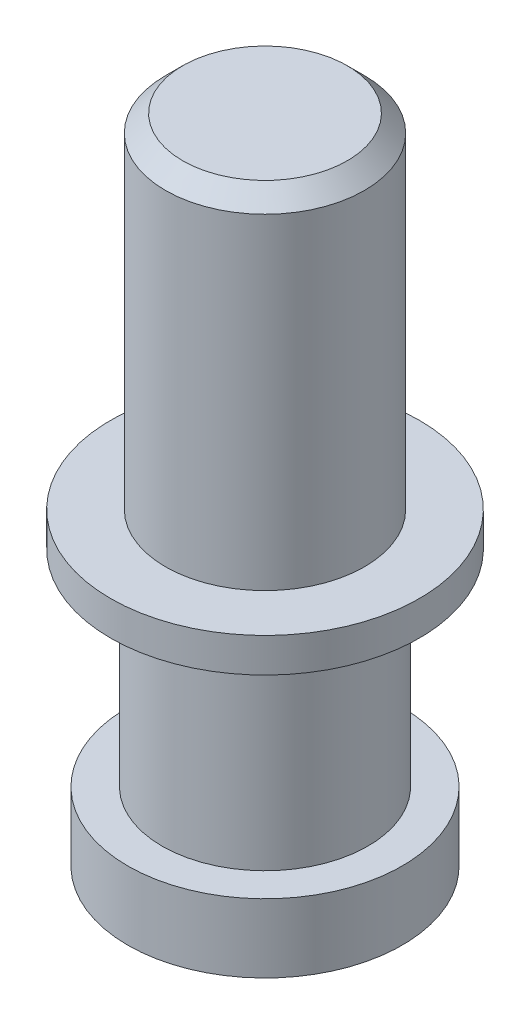
ISO-10303-21;
HEADER;
FILE_DESCRIPTION(('STEP AP214'),'2;1');
FILE_NAME('part.step','',(''),(''),'','','');
FILE_SCHEMA(('AUTOMOTIVE_DESIGN { 1 0 10303 214 1 1 1 1 }'));
ENDSEC;
DATA;
#1=APPLICATION_CONTEXT('core data for automotive mechanical design processes');
#2=APPLICATION_PROTOCOL_DEFINITION('international standard','automotive_design',2000,#1);
#3=PRODUCT_CONTEXT('',#1,'mechanical');
#4=PRODUCT('Part','Part','',(#3));
#5=PRODUCT_RELATED_PRODUCT_CATEGORY('part','',(#4));
#6=PRODUCT_DEFINITION_FORMATION('','',#4);
#7=PRODUCT_DEFINITION_CONTEXT('part definition',#1,'design');
#8=PRODUCT_DEFINITION('design','',#6,#7);
#9=PRODUCT_DEFINITION_SHAPE('','',#8);
#10=(LENGTH_UNIT() NAMED_UNIT(*) SI_UNIT(.MILLI.,.METRE.));
#11=(NAMED_UNIT(*) PLANE_ANGLE_UNIT() SI_UNIT($,.RADIAN.));
#12=(NAMED_UNIT(*) SI_UNIT($,.STERADIAN.) SOLID_ANGLE_UNIT());
#13=UNCERTAINTY_MEASURE_WITH_UNIT(LENGTH_MEASURE(1.E-05),#10,'distance_accuracy_value','');
#14=(GEOMETRIC_REPRESENTATION_CONTEXT(3) GLOBAL_UNCERTAINTY_ASSIGNED_CONTEXT((#13)) GLOBAL_UNIT_ASSIGNED_CONTEXT((#10,
#11,#12)) REPRESENTATION_CONTEXT('',''));
#15=CARTESIAN_POINT('',(0.,0.,0.));
#16=DIRECTION('',(0.,0.,1.));
#17=DIRECTION('',(1.,0.,0.));
#18=AXIS2_PLACEMENT_3D('',#15,#16,#17);
#19=CARTESIAN_POINT('',(0.,1.,0.));
#20=DIRECTION('',(0.,-1.,0.));
#21=DIRECTION('',(0.,0.,-1.));
#22=AXIS2_PLACEMENT_3D('',#19,#20,#21);
#23=CYLINDRICAL_SURFACE('',#22,2.);
#24=CARTESIAN_POINT('',(0.,1.,0.));
#25=DIRECTION('',(0.,1.,0.));
#26=DIRECTION('',(0.,0.,1.));
#27=AXIS2_PLACEMENT_3D('',#24,#25,#26);
#28=CIRCLE('',#27,2.);
#29=CARTESIAN_POINT('',(0.,1.,2.));
#30=VERTEX_POINT('',#29);
#31=EDGE_CURVE('E59',#30,#30,#28,.T.);
#32=ORIENTED_EDGE('',*,*,#31,.F.);
#33=EDGE_LOOP('',(#32));
#34=FACE_BOUND('',#33,.T.);
#35=CARTESIAN_POINT('',(0.,0.,0.));
#36=DIRECTION('',(0.,1.,0.));
#37=DIRECTION('',(0.,0.,1.));
#38=AXIS2_PLACEMENT_3D('',#35,#36,#37);
#39=CIRCLE('',#38,2.);
#40=CARTESIAN_POINT('',(0.,0.,2.));
#41=VERTEX_POINT('',#40);
#42=EDGE_CURVE('E56',#41,#41,#39,.T.);
#43=ORIENTED_EDGE('',*,*,#42,.T.);
#44=EDGE_LOOP('',(#43));
#45=FACE_BOUND('',#44,.T.);
#46=ADVANCED_FACE('F37',(#34,#45),#23,.T.);
#47=CARTESIAN_POINT('',(0.,1.,0.));
#48=DIRECTION('',(0.,1.,0.));
#49=DIRECTION('',(0.,0.,1.));
#50=AXIS2_PLACEMENT_3D('',#47,#48,#49);
#51=PLANE('',#50);
#52=CARTESIAN_POINT('',(0.,1.,0.));
#53=DIRECTION('',(0.,1.,0.));
#54=DIRECTION('',(0.,0.,1.));
#55=AXIS2_PLACEMENT_3D('',#52,#53,#54);
#56=CIRCLE('',#55,1.5);
#57=CARTESIAN_POINT('',(0.,1.,1.5));
#58=VERTEX_POINT('',#57);
#59=EDGE_CURVE('E53',#58,#58,#56,.T.);
#60=ORIENTED_EDGE('',*,*,#59,.F.);
#61=EDGE_LOOP('',(#60));
#62=FACE_BOUND('',#61,.T.);
#63=ORIENTED_EDGE('',*,*,#31,.T.);
#64=EDGE_LOOP('',(#63));
#65=FACE_BOUND('',#64,.T.);
#66=ADVANCED_FACE('F97',(#62,#65),#51,.T.);
#67=CARTESIAN_POINT('',(0.,0.,0.));
#68=DIRECTION('',(0.,1.,0.));
#69=DIRECTION('',(0.,0.,1.));
#70=AXIS2_PLACEMENT_3D('',#67,#68,#69);
#71=PLANE('',#70);
#72=ORIENTED_EDGE('',*,*,#42,.F.);
#73=EDGE_LOOP('',(#72));
#74=FACE_BOUND('',#73,.T.);
#75=ADVANCED_FACE('F102',(#74),#71,.F.);
#76=CARTESIAN_POINT('',(0.,4.,0.));
#77=DIRECTION('',(0.,-1.,0.));
#78=DIRECTION('',(0.,0.,-1.));
#79=AXIS2_PLACEMENT_3D('',#76,#77,#78);
#80=CYLINDRICAL_SURFACE('',#79,1.5);
#81=CARTESIAN_POINT('',(0.,4.,0.));
#82=DIRECTION('',(0.,1.,0.));
#83=DIRECTION('',(0.,0.,1.));
#84=AXIS2_PLACEMENT_3D('',#81,#82,#83);
#85=CIRCLE('',#84,1.5);
#86=CARTESIAN_POINT('',(0.,4.,1.5));
#87=VERTEX_POINT('',#86);
#88=EDGE_CURVE('E60',#87,#87,#85,.T.);
#89=ORIENTED_EDGE('',*,*,#88,.F.);
#90=EDGE_LOOP('',(#89));
#91=FACE_BOUND('',#90,.T.);
#92=ORIENTED_EDGE('',*,*,#59,.T.);
#93=EDGE_LOOP('',(#92));
#94=FACE_BOUND('',#93,.T.);
#95=ADVANCED_FACE('F79',(#91,#94),#80,.T.);
#96=CARTESIAN_POINT('',(0.,4.5,0.));
#97=DIRECTION('',(0.,-1.,0.));
#98=DIRECTION('',(0.,0.,-1.));
#99=AXIS2_PLACEMENT_3D('',#96,#97,#98);
#100=CYLINDRICAL_SURFACE('',#99,2.25);
#101=CARTESIAN_POINT('',(0.,4.5,0.));
#102=DIRECTION('',(0.,1.,0.));
#103=DIRECTION('',(0.,0.,1.));
#104=AXIS2_PLACEMENT_3D('',#101,#102,#103);
#105=CIRCLE('',#104,2.25);
#106=CARTESIAN_POINT('',(0.,4.5,2.25));
#107=VERTEX_POINT('',#106);
#108=EDGE_CURVE('E67',#107,#107,#105,.T.);
#109=ORIENTED_EDGE('',*,*,#108,.F.);
#110=EDGE_LOOP('',(#109));
#111=FACE_BOUND('',#110,.T.);
#112=CARTESIAN_POINT('',(0.,4.,0.));
#113=DIRECTION('',(0.,1.,0.));
#114=DIRECTION('',(0.,0.,1.));
#115=AXIS2_PLACEMENT_3D('',#112,#113,#114);
#116=CIRCLE('',#115,2.25);
#117=CARTESIAN_POINT('',(0.,4.,2.25));
#118=VERTEX_POINT('',#117);
#119=EDGE_CURVE('E68',#118,#118,#116,.T.);
#120=ORIENTED_EDGE('',*,*,#119,.T.);
#121=EDGE_LOOP('',(#120));
#122=FACE_BOUND('',#121,.T.);
#123=ADVANCED_FACE('F76',(#111,#122),#100,.T.);
#124=CARTESIAN_POINT('',(0.,4.5,0.));
#125=DIRECTION('',(0.,1.,0.));
#126=DIRECTION('',(0.,0.,1.));
#127=AXIS2_PLACEMENT_3D('',#124,#125,#126);
#128=PLANE('',#127);
#129=CARTESIAN_POINT('',(0.,4.5,0.));
#130=DIRECTION('',(0.,1.,0.));
#131=DIRECTION('',(0.,0.,1.));
#132=AXIS2_PLACEMENT_3D('',#129,#130,#131);
#133=CIRCLE('',#132,1.45);
#134=CARTESIAN_POINT('',(0.,4.5,1.45));
#135=VERTEX_POINT('',#134);
#136=EDGE_CURVE('E49',#135,#135,#133,.T.);
#137=ORIENTED_EDGE('',*,*,#136,.F.);
#138=EDGE_LOOP('',(#137));
#139=FACE_BOUND('',#138,.T.);
#140=ORIENTED_EDGE('',*,*,#108,.T.);
#141=EDGE_LOOP('',(#140));
#142=FACE_BOUND('',#141,.T.);
#143=ADVANCED_FACE('F74',(#139,#142),#128,.T.);
#144=CARTESIAN_POINT('',(0.,4.,0.));
#145=DIRECTION('',(0.,1.,0.));
#146=DIRECTION('',(0.,0.,1.));
#147=AXIS2_PLACEMENT_3D('',#144,#145,#146);
#148=PLANE('',#147);
#149=ORIENTED_EDGE('',*,*,#88,.T.);
#150=EDGE_LOOP('',(#149));
#151=FACE_BOUND('',#150,.T.);
#152=ORIENTED_EDGE('',*,*,#119,.F.);
#153=EDGE_LOOP('',(#152));
#154=FACE_BOUND('',#153,.T.);
#155=ADVANCED_FACE('F83',(#151,#154),#148,.F.);
#156=CARTESIAN_POINT('',(0.,9.5,0.));
#157=DIRECTION('',(0.,-1.,0.));
#158=DIRECTION('',(0.,0.,-1.));
#159=AXIS2_PLACEMENT_3D('',#156,#157,#158);
#160=CYLINDRICAL_SURFACE('',#159,1.45);
#161=CARTESIAN_POINT('',(0.,9.25,0.));
#162=DIRECTION('',(0.,1.,0.));
#163=DIRECTION('',(0.,0.,1.));
#164=AXIS2_PLACEMENT_3D('',#161,#162,#163);
#165=CIRCLE('',#164,1.45);
#166=CARTESIAN_POINT('',(0.,9.25,1.45));
#167=VERTEX_POINT('',#166);
#168=EDGE_CURVE('E10',#167,#167,#165,.F.);
#169=ORIENTED_EDGE('',*,*,#168,.T.);
#170=EDGE_LOOP('',(#169));
#171=FACE_BOUND('',#170,.T.);
#172=ORIENTED_EDGE('',*,*,#136,.T.);
#173=EDGE_LOOP('',(#172));
#174=FACE_BOUND('',#173,.T.);
#175=ADVANCED_FACE('F85',(#171,#174),#160,.T.);
#176=CARTESIAN_POINT('',(0.,9.5,0.));
#177=DIRECTION('',(0.,1.,0.));
#178=DIRECTION('',(0.,0.,1.));
#179=AXIS2_PLACEMENT_3D('',#176,#177,#178);
#180=PLANE('',#179);
#181=CARTESIAN_POINT('',(0.,9.5,0.));
#182=DIRECTION('',(0.,1.,0.));
#183=DIRECTION('',(0.,0.,1.));
#184=AXIS2_PLACEMENT_3D('',#181,#182,#183);
#185=CIRCLE('',#184,1.2);
#186=CARTESIAN_POINT('',(0.,9.5,1.2));
#187=VERTEX_POINT('',#186);
#188=EDGE_CURVE('E45',#187,#187,#185,.T.);
#189=ORIENTED_EDGE('',*,*,#188,.T.);
#190=EDGE_LOOP('',(#189));
#191=FACE_BOUND('',#190,.T.);
#192=ADVANCED_FACE('F92',(#191),#180,.T.);
#193=CARTESIAN_POINT('',(0.,9.5,0.));
#194=DIRECTION('',(0.,-1.,0.));
#195=DIRECTION('',(0.,0.,-1.));
#196=AXIS2_PLACEMENT_3D('',#193,#194,#195);
#197=CONICAL_SURFACE('',#196,1.2,0.785398163397445);
#198=ORIENTED_EDGE('',*,*,#168,.F.);
#199=EDGE_LOOP('',(#198));
#200=FACE_BOUND('',#199,.T.);
#201=ORIENTED_EDGE('',*,*,#188,.F.);
#202=EDGE_LOOP('',(#201));
#203=FACE_BOUND('',#202,.T.);
#204=ADVANCED_FACE('F40',(#200,#203),#197,.T.);
#205=CLOSED_SHELL('',(#46,#66,#75,#95,#123,#143,#155,#175,#192,#204));
#206=MANIFOLD_SOLID_BREP('B2',#205);
#207=ADVANCED_BREP_SHAPE_REPRESENTATION('',(#18,#206),#14);
#208=SHAPE_DEFINITION_REPRESENTATION(#9,#207);
ENDSEC;
END-ISO-10303-21;
